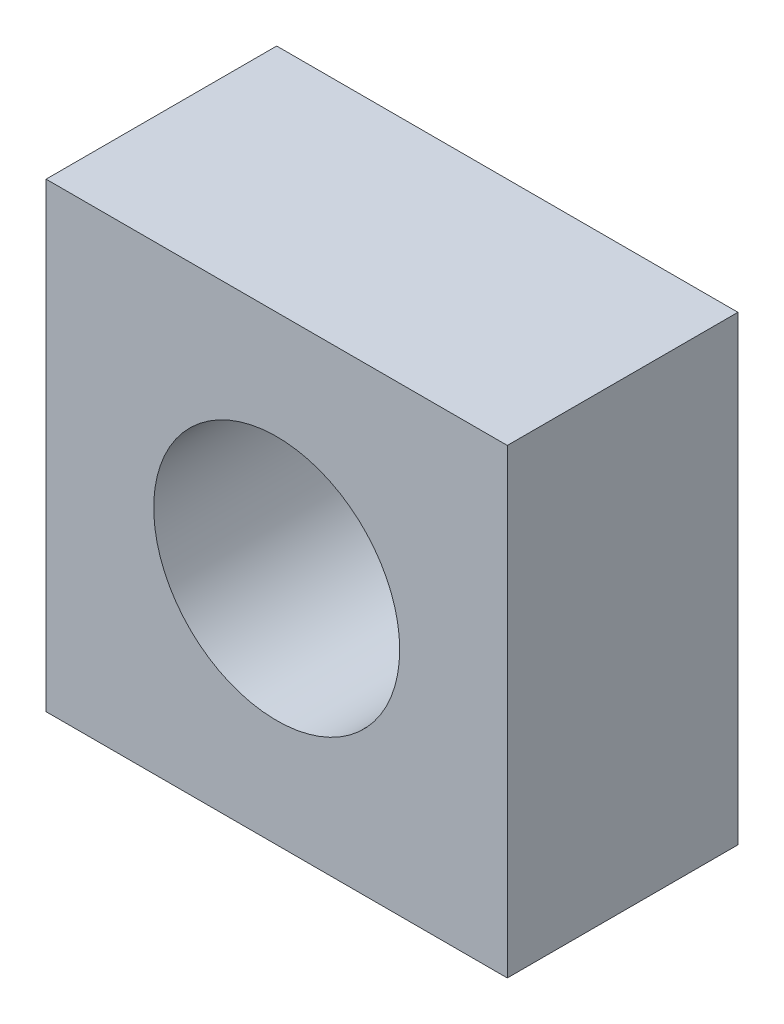
ISO-10303-21;
HEADER;
FILE_DESCRIPTION(('STEP AP214'),'2;1');
FILE_NAME('part.step','',(''),(''),'','','');
FILE_SCHEMA(('AUTOMOTIVE_DESIGN { 1 0 10303 214 1 1 1 1 }'));
ENDSEC;
DATA;
#1=APPLICATION_CONTEXT('core data for automotive mechanical design processes');
#2=APPLICATION_PROTOCOL_DEFINITION('international standard','automotive_design',2000,#1);
#3=PRODUCT_CONTEXT('',#1,'mechanical');
#4=PRODUCT('Part','Part','',(#3));
#5=PRODUCT_RELATED_PRODUCT_CATEGORY('part','',(#4));
#6=PRODUCT_DEFINITION_FORMATION('','',#4);
#7=PRODUCT_DEFINITION_CONTEXT('part definition',#1,'design');
#8=PRODUCT_DEFINITION('design','',#6,#7);
#9=PRODUCT_DEFINITION_SHAPE('','',#8);
#10=(LENGTH_UNIT() NAMED_UNIT(*) SI_UNIT(.MILLI.,.METRE.));
#11=(NAMED_UNIT(*) PLANE_ANGLE_UNIT() SI_UNIT($,.RADIAN.));
#12=(NAMED_UNIT(*) SI_UNIT($,.STERADIAN.) SOLID_ANGLE_UNIT());
#13=UNCERTAINTY_MEASURE_WITH_UNIT(LENGTH_MEASURE(1.E-05),#10,'distance_accuracy_value','');
#14=(GEOMETRIC_REPRESENTATION_CONTEXT(3) GLOBAL_UNCERTAINTY_ASSIGNED_CONTEXT((#13)) GLOBAL_UNIT_ASSIGNED_CONTEXT((#10,
#11,#12)) REPRESENTATION_CONTEXT('',''));
#15=CARTESIAN_POINT('',(0.,0.,0.));
#16=DIRECTION('',(0.,0.,1.));
#17=DIRECTION('',(1.,0.,0.));
#18=AXIS2_PLACEMENT_3D('',#15,#16,#17);
#19=CARTESIAN_POINT('',(0.,0.,3.));
#20=DIRECTION('',(0.,0.,-1.));
#21=DIRECTION('',(-1.,0.,0.));
#22=AXIS2_PLACEMENT_3D('',#19,#20,#21);
#23=PLANE('',#22);
#24=DIRECTION('',(0.,-1.,0.));
#25=VECTOR('',#24,1.);
#26=CARTESIAN_POINT('',(0.,0.,3.));
#27=LINE('',#26,#25);
#28=CARTESIAN_POINT('',(0.,6.,3.));
#29=VERTEX_POINT('',#28);
#30=CARTESIAN_POINT('',(0.,0.,3.));
#31=VERTEX_POINT('',#30);
#32=EDGE_CURVE('E86',#29,#31,#27,.T.);
#33=ORIENTED_EDGE('',*,*,#32,.T.);
#34=DIRECTION('',(1.,0.,0.));
#35=VECTOR('',#34,1.);
#36=CARTESIAN_POINT('',(0.,0.,3.));
#37=LINE('',#36,#35);
#38=CARTESIAN_POINT('',(6.,0.,3.));
#39=VERTEX_POINT('',#38);
#40=EDGE_CURVE('E81',#31,#39,#37,.T.);
#41=ORIENTED_EDGE('',*,*,#40,.T.);
#42=DIRECTION('',(0.,1.,0.));
#43=VECTOR('',#42,1.);
#44=CARTESIAN_POINT('',(6.,0.,3.));
#45=LINE('',#44,#43);
#46=CARTESIAN_POINT('',(6.,6.,3.));
#47=VERTEX_POINT('',#46);
#48=EDGE_CURVE('E84',#39,#47,#45,.T.);
#49=ORIENTED_EDGE('',*,*,#48,.T.);
#50=DIRECTION('',(-1.,0.,0.));
#51=VECTOR('',#50,1.);
#52=CARTESIAN_POINT('',(0.,6.,3.));
#53=LINE('',#52,#51);
#54=EDGE_CURVE('E51',#47,#29,#53,.T.);
#55=ORIENTED_EDGE('',*,*,#54,.T.);
#56=EDGE_LOOP('',(#33,#41,#49,#55));
#57=FACE_BOUND('',#56,.T.);
#58=CARTESIAN_POINT('',(3.,3.,3.));
#59=DIRECTION('',(0.,0.,1.));
#60=DIRECTION('',(1.,0.,0.));
#61=AXIS2_PLACEMENT_3D('',#58,#59,#60);
#62=CIRCLE('',#61,1.6);
#63=CARTESIAN_POINT('',(4.6,3.,3.));
#64=VERTEX_POINT('',#63);
#65=EDGE_CURVE('E101',#64,#64,#62,.T.);
#66=ORIENTED_EDGE('',*,*,#65,.F.);
#67=EDGE_LOOP('',(#66));
#68=FACE_BOUND('',#67,.T.);
#69=ADVANCED_FACE('F34',(#57,#68),#23,.F.);
#70=CARTESIAN_POINT('',(0.,0.,0.));
#71=DIRECTION('',(0.,0.,-1.));
#72=DIRECTION('',(-1.,0.,0.));
#73=AXIS2_PLACEMENT_3D('',#70,#71,#72);
#74=PLANE('',#73);
#75=DIRECTION('',(0.,-1.,0.));
#76=VECTOR('',#75,1.);
#77=CARTESIAN_POINT('',(0.,0.,0.));
#78=LINE('',#77,#76);
#79=CARTESIAN_POINT('',(0.,6.,0.));
#80=VERTEX_POINT('',#79);
#81=CARTESIAN_POINT('',(0.,0.,0.));
#82=VERTEX_POINT('',#81);
#83=EDGE_CURVE('E98',#80,#82,#78,.T.);
#84=ORIENTED_EDGE('',*,*,#83,.F.);
#85=DIRECTION('',(-1.,0.,0.));
#86=VECTOR('',#85,1.);
#87=CARTESIAN_POINT('',(0.,6.,0.));
#88=LINE('',#87,#86);
#89=CARTESIAN_POINT('',(6.,6.,0.));
#90=VERTEX_POINT('',#89);
#91=EDGE_CURVE('E74',#90,#80,#88,.T.);
#92=ORIENTED_EDGE('',*,*,#91,.F.);
#93=DIRECTION('',(0.,1.,0.));
#94=VECTOR('',#93,1.);
#95=CARTESIAN_POINT('',(6.,0.,0.));
#96=LINE('',#95,#94);
#97=CARTESIAN_POINT('',(6.,0.,0.));
#98=VERTEX_POINT('',#97);
#99=EDGE_CURVE('E68',#98,#90,#96,.T.);
#100=ORIENTED_EDGE('',*,*,#99,.F.);
#101=DIRECTION('',(1.,0.,0.));
#102=VECTOR('',#101,1.);
#103=CARTESIAN_POINT('',(0.,0.,0.));
#104=LINE('',#103,#102);
#105=EDGE_CURVE('E90',#82,#98,#104,.T.);
#106=ORIENTED_EDGE('',*,*,#105,.F.);
#107=EDGE_LOOP('',(#84,#92,#100,#106));
#108=FACE_BOUND('',#107,.T.);
#109=CARTESIAN_POINT('',(3.,3.,0.));
#110=DIRECTION('',(0.,0.,1.));
#111=DIRECTION('',(1.,0.,0.));
#112=AXIS2_PLACEMENT_3D('',#109,#110,#111);
#113=CIRCLE('',#112,1.6);
#114=CARTESIAN_POINT('',(4.6,3.,0.));
#115=VERTEX_POINT('',#114);
#116=EDGE_CURVE('E113',#115,#115,#113,.T.);
#117=ORIENTED_EDGE('',*,*,#116,.T.);
#118=EDGE_LOOP('',(#117));
#119=FACE_BOUND('',#118,.T.);
#120=ADVANCED_FACE('F109',(#108,#119),#74,.T.);
#121=CARTESIAN_POINT('',(0.,0.,3.));
#122=DIRECTION('',(1.,0.,0.));
#123=DIRECTION('',(0.,0.,-1.));
#124=AXIS2_PLACEMENT_3D('',#121,#122,#123);
#125=PLANE('',#124);
#126=ORIENTED_EDGE('',*,*,#83,.T.);
#127=DIRECTION('',(0.,0.,-1.));
#128=VECTOR('',#127,1.);
#129=CARTESIAN_POINT('',(0.,0.,3.));
#130=LINE('',#129,#128);
#131=EDGE_CURVE('E11',#31,#82,#130,.T.);
#132=ORIENTED_EDGE('',*,*,#131,.F.);
#133=ORIENTED_EDGE('',*,*,#32,.F.);
#134=DIRECTION('',(0.,0.,-1.));
#135=VECTOR('',#134,1.);
#136=CARTESIAN_POINT('',(0.,6.,3.));
#137=LINE('',#136,#135);
#138=EDGE_CURVE('E94',#29,#80,#137,.T.);
#139=ORIENTED_EDGE('',*,*,#138,.T.);
#140=EDGE_LOOP('',(#126,#132,#133,#139));
#141=FACE_BOUND('',#140,.T.);
#142=ADVANCED_FACE('F36',(#141),#125,.F.);
#143=CARTESIAN_POINT('',(0.,0.,3.));
#144=DIRECTION('',(0.,1.,0.));
#145=DIRECTION('',(0.,0.,1.));
#146=AXIS2_PLACEMENT_3D('',#143,#144,#145);
#147=PLANE('',#146);
#148=ORIENTED_EDGE('',*,*,#105,.T.);
#149=DIRECTION('',(0.,0.,-1.));
#150=VECTOR('',#149,1.);
#151=CARTESIAN_POINT('',(6.,0.,3.));
#152=LINE('',#151,#150);
#153=EDGE_CURVE('E43',#39,#98,#152,.T.);
#154=ORIENTED_EDGE('',*,*,#153,.F.);
#155=ORIENTED_EDGE('',*,*,#40,.F.);
#156=ORIENTED_EDGE('',*,*,#131,.T.);
#157=EDGE_LOOP('',(#148,#154,#155,#156));
#158=FACE_BOUND('',#157,.T.);
#159=ADVANCED_FACE('F89',(#158),#147,.F.);
#160=CARTESIAN_POINT('',(6.,0.,3.));
#161=DIRECTION('',(-1.,0.,0.));
#162=DIRECTION('',(0.,0.,1.));
#163=AXIS2_PLACEMENT_3D('',#160,#161,#162);
#164=PLANE('',#163);
#165=ORIENTED_EDGE('',*,*,#99,.T.);
#166=DIRECTION('',(0.,0.,-1.));
#167=VECTOR('',#166,1.);
#168=CARTESIAN_POINT('',(6.,6.,3.));
#169=LINE('',#168,#167);
#170=EDGE_CURVE('E91',#47,#90,#169,.T.);
#171=ORIENTED_EDGE('',*,*,#170,.F.);
#172=ORIENTED_EDGE('',*,*,#48,.F.);
#173=ORIENTED_EDGE('',*,*,#153,.T.);
#174=EDGE_LOOP('',(#165,#171,#172,#173));
#175=FACE_BOUND('',#174,.T.);
#176=ADVANCED_FACE('F92',(#175),#164,.F.);
#177=CARTESIAN_POINT('',(0.,6.,3.));
#178=DIRECTION('',(0.,-1.,0.));
#179=DIRECTION('',(0.,0.,-1.));
#180=AXIS2_PLACEMENT_3D('',#177,#178,#179);
#181=PLANE('',#180);
#182=ORIENTED_EDGE('',*,*,#91,.T.);
#183=ORIENTED_EDGE('',*,*,#138,.F.);
#184=ORIENTED_EDGE('',*,*,#54,.F.);
#185=ORIENTED_EDGE('',*,*,#170,.T.);
#186=EDGE_LOOP('',(#182,#183,#184,#185));
#187=FACE_BOUND('',#186,.T.);
#188=ADVANCED_FACE('F106',(#187),#181,.F.);
#189=CARTESIAN_POINT('',(3.,3.,3.));
#190=DIRECTION('',(0.,0.,-1.));
#191=DIRECTION('',(-1.,0.,0.));
#192=AXIS2_PLACEMENT_3D('',#189,#190,#191);
#193=CYLINDRICAL_SURFACE('',#192,1.6);
#194=ORIENTED_EDGE('',*,*,#65,.T.);
#195=EDGE_LOOP('',(#194));
#196=FACE_BOUND('',#195,.T.);
#197=ORIENTED_EDGE('',*,*,#116,.F.);
#198=EDGE_LOOP('',(#197));
#199=FACE_BOUND('',#198,.T.);
#200=ADVANCED_FACE('F119',(#196,#199),#193,.F.);
#201=CLOSED_SHELL('',(#69,#120,#142,#159,#176,#188,#200));
#202=MANIFOLD_SOLID_BREP('B2',#201);
#203=ADVANCED_BREP_SHAPE_REPRESENTATION('',(#18,#202),#14);
#204=SHAPE_DEFINITION_REPRESENTATION(#9,#203);
ENDSEC;
END-ISO-10303-21;
